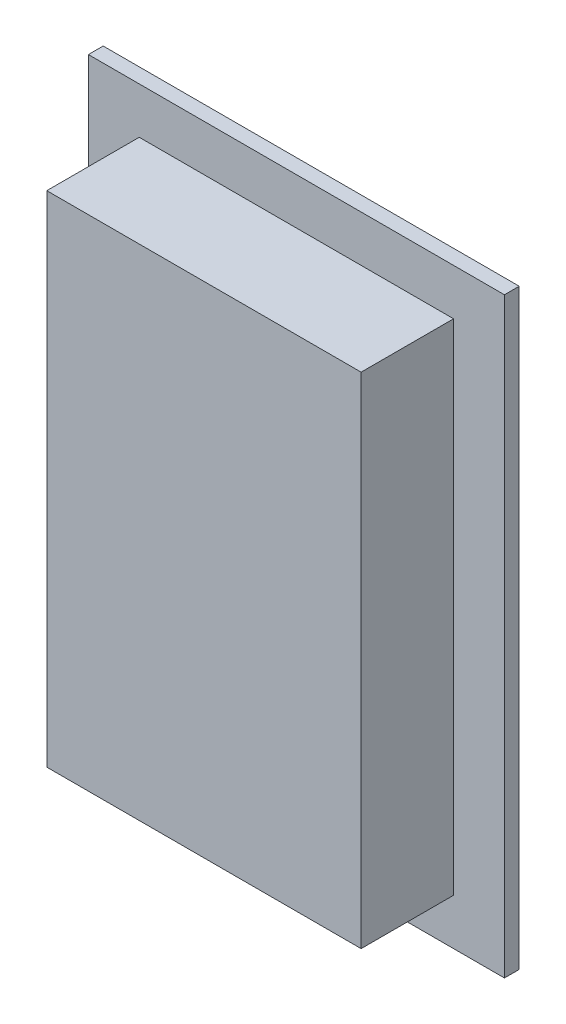
ISO-10303-21;
HEADER;
FILE_DESCRIPTION(('STEP AP214'),'2;1');
FILE_NAME('part.step','',(''),(''),'','','');
FILE_SCHEMA(('AUTOMOTIVE_DESIGN { 1 0 10303 214 1 1 1 1 }'));
ENDSEC;
DATA;
#1=APPLICATION_CONTEXT('core data for automotive mechanical design processes');
#2=APPLICATION_PROTOCOL_DEFINITION('international standard','automotive_design',2000,#1);
#3=PRODUCT_CONTEXT('',#1,'mechanical');
#4=PRODUCT('Part','Part','',(#3));
#5=PRODUCT_RELATED_PRODUCT_CATEGORY('part','',(#4));
#6=PRODUCT_DEFINITION_FORMATION('','',#4);
#7=PRODUCT_DEFINITION_CONTEXT('part definition',#1,'design');
#8=PRODUCT_DEFINITION('design','',#6,#7);
#9=PRODUCT_DEFINITION_SHAPE('','',#8);
#10=(LENGTH_UNIT() NAMED_UNIT(*) SI_UNIT(.MILLI.,.METRE.));
#11=(NAMED_UNIT(*) PLANE_ANGLE_UNIT() SI_UNIT($,.RADIAN.));
#12=(NAMED_UNIT(*) SI_UNIT($,.STERADIAN.) SOLID_ANGLE_UNIT());
#13=UNCERTAINTY_MEASURE_WITH_UNIT(LENGTH_MEASURE(1.E-05),#10,'distance_accuracy_value','');
#14=(GEOMETRIC_REPRESENTATION_CONTEXT(3) GLOBAL_UNCERTAINTY_ASSIGNED_CONTEXT((#13)) GLOBAL_UNIT_ASSIGNED_CONTEXT((#10,
#11,#12)) REPRESENTATION_CONTEXT('',''));
#15=CARTESIAN_POINT('',(0.,0.,0.));
#16=DIRECTION('',(0.,0.,1.));
#17=DIRECTION('',(1.,0.,0.));
#18=AXIS2_PLACEMENT_3D('',#15,#16,#17);
#19=CARTESIAN_POINT('',(0.,0.,19.2));
#20=DIRECTION('',(0.,0.,-1.));
#21=DIRECTION('',(-1.,0.,0.));
#22=AXIS2_PLACEMENT_3D('',#19,#20,#21);
#23=PLANE('',#22);
#24=DIRECTION('',(0.,-1.,0.));
#25=VECTOR('',#24,1.);
#26=CARTESIAN_POINT('',(-97.5,-32.,19.2));
#27=LINE('',#26,#25);
#28=CARTESIAN_POINT('',(-97.5,32.,19.2));
#29=VERTEX_POINT('',#28);
#30=CARTESIAN_POINT('',(-97.5,-32.,19.2));
#31=VERTEX_POINT('',#30);
#32=EDGE_CURVE('E139',#29,#31,#27,.T.);
#33=ORIENTED_EDGE('',*,*,#32,.T.);
#34=DIRECTION('',(1.,0.,0.));
#35=VECTOR('',#34,1.);
#36=CARTESIAN_POINT('',(-97.5,-32.,19.2));
#37=LINE('',#36,#35);
#38=CARTESIAN_POINT('',(-52.5,-32.,19.2));
#39=VERTEX_POINT('',#38);
#40=EDGE_CURVE('E143',#31,#39,#37,.T.);
#41=ORIENTED_EDGE('',*,*,#40,.T.);
#42=DIRECTION('',(0.,1.,0.));
#43=VECTOR('',#42,1.);
#44=CARTESIAN_POINT('',(-52.5,-32.,19.2));
#45=LINE('',#44,#43);
#46=CARTESIAN_POINT('',(-52.5,32.,19.2));
#47=VERTEX_POINT('',#46);
#48=EDGE_CURVE('E147',#39,#47,#45,.T.);
#49=ORIENTED_EDGE('',*,*,#48,.T.);
#50=DIRECTION('',(-1.,0.,0.));
#51=VECTOR('',#50,1.);
#52=CARTESIAN_POINT('',(-97.5,32.,19.2));
#53=LINE('',#52,#51);
#54=EDGE_CURVE('E150',#47,#29,#53,.T.);
#55=ORIENTED_EDGE('',*,*,#54,.T.);
#56=EDGE_LOOP('',(#33,#41,#49,#55));
#57=FACE_BOUND('',#56,.T.);
#58=DIRECTION('',(0.,-1.,0.));
#59=VECTOR('',#58,1.);
#60=CARTESIAN_POINT('',(-92.,-27.,19.2));
#61=LINE('',#60,#59);
#62=CARTESIAN_POINT('',(-92.,27.,19.2));
#63=VERTEX_POINT('',#62);
#64=CARTESIAN_POINT('',(-92.,-27.,19.2));
#65=VERTEX_POINT('',#64);
#66=EDGE_CURVE('E55',#63,#65,#61,.T.);
#67=ORIENTED_EDGE('',*,*,#66,.F.);
#68=DIRECTION('',(-1.,0.,0.));
#69=VECTOR('',#68,1.);
#70=CARTESIAN_POINT('',(-92.,27.,19.2));
#71=LINE('',#70,#69);
#72=CARTESIAN_POINT('',(-58.,27.,19.2));
#73=VERTEX_POINT('',#72);
#74=EDGE_CURVE('E59',#73,#63,#71,.T.);
#75=ORIENTED_EDGE('',*,*,#74,.F.);
#76=DIRECTION('',(0.,1.,0.));
#77=VECTOR('',#76,1.);
#78=CARTESIAN_POINT('',(-58.,-27.,19.2));
#79=LINE('',#78,#77);
#80=CARTESIAN_POINT('',(-58.,-27.,19.2));
#81=VERTEX_POINT('',#80);
#82=EDGE_CURVE('E283',#81,#73,#79,.T.);
#83=ORIENTED_EDGE('',*,*,#82,.F.);
#84=DIRECTION('',(1.,0.,0.));
#85=VECTOR('',#84,1.);
#86=CARTESIAN_POINT('',(-92.,-27.,19.2));
#87=LINE('',#86,#85);
#88=EDGE_CURVE('E293',#65,#81,#87,.T.);
#89=ORIENTED_EDGE('',*,*,#88,.F.);
#90=EDGE_LOOP('',(#67,#75,#83,#89));
#91=FACE_BOUND('',#90,.T.);
#92=ADVANCED_FACE('F39',(#57,#91),#23,.F.);
#93=CARTESIAN_POINT('',(-97.5,-32.,19.2));
#94=DIRECTION('',(1.,0.,0.));
#95=DIRECTION('',(0.,0.,-1.));
#96=AXIS2_PLACEMENT_3D('',#93,#94,#95);
#97=PLANE('',#96);
#98=DIRECTION('',(0.,-1.,0.));
#99=VECTOR('',#98,1.);
#100=CARTESIAN_POINT('',(-97.5,-32.,17.6));
#101=LINE('',#100,#99);
#102=CARTESIAN_POINT('',(-97.5,32.,17.6));
#103=VERTEX_POINT('',#102);
#104=CARTESIAN_POINT('',(-97.5,-32.,17.6));
#105=VERTEX_POINT('',#104);
#106=EDGE_CURVE('E128',#103,#105,#101,.T.);
#107=ORIENTED_EDGE('',*,*,#106,.T.);
#108=DIRECTION('',(0.,0.,-1.));
#109=VECTOR('',#108,1.);
#110=CARTESIAN_POINT('',(-97.5,-32.,19.2));
#111=LINE('',#110,#109);
#112=EDGE_CURVE('E11',#31,#105,#111,.T.);
#113=ORIENTED_EDGE('',*,*,#112,.F.);
#114=ORIENTED_EDGE('',*,*,#32,.F.);
#115=DIRECTION('',(0.,0.,-1.));
#116=VECTOR('',#115,1.);
#117=CARTESIAN_POINT('',(-97.5,32.,19.2));
#118=LINE('',#117,#116);
#119=EDGE_CURVE('E152',#29,#103,#118,.T.);
#120=ORIENTED_EDGE('',*,*,#119,.T.);
#121=EDGE_LOOP('',(#107,#113,#114,#120));
#122=FACE_BOUND('',#121,.T.);
#123=ADVANCED_FACE('F41',(#122),#97,.F.);
#124=CARTESIAN_POINT('',(-97.5,-32.,19.2));
#125=DIRECTION('',(0.,1.,0.));
#126=DIRECTION('',(0.,0.,1.));
#127=AXIS2_PLACEMENT_3D('',#124,#125,#126);
#128=PLANE('',#127);
#129=DIRECTION('',(1.,0.,0.));
#130=VECTOR('',#129,1.);
#131=CARTESIAN_POINT('',(-97.5,-32.,17.6));
#132=LINE('',#131,#130);
#133=CARTESIAN_POINT('',(-52.5,-32.,17.6));
#134=VERTEX_POINT('',#133);
#135=EDGE_CURVE('E133',#105,#134,#132,.T.);
#136=ORIENTED_EDGE('',*,*,#135,.T.);
#137=DIRECTION('',(0.,0.,-1.));
#138=VECTOR('',#137,1.);
#139=CARTESIAN_POINT('',(-52.5,-32.,19.2));
#140=LINE('',#139,#138);
#141=EDGE_CURVE('E48',#39,#134,#140,.T.);
#142=ORIENTED_EDGE('',*,*,#141,.F.);
#143=ORIENTED_EDGE('',*,*,#40,.F.);
#144=ORIENTED_EDGE('',*,*,#112,.T.);
#145=EDGE_LOOP('',(#136,#142,#143,#144));
#146=FACE_BOUND('',#145,.T.);
#147=ADVANCED_FACE('F188',(#146),#128,.F.);
#148=CARTESIAN_POINT('',(-52.5,-32.,19.2));
#149=DIRECTION('',(-1.,0.,0.));
#150=DIRECTION('',(0.,0.,1.));
#151=AXIS2_PLACEMENT_3D('',#148,#149,#150);
#152=PLANE('',#151);
#153=DIRECTION('',(0.,1.,0.));
#154=VECTOR('',#153,1.);
#155=CARTESIAN_POINT('',(-52.5,-32.,17.6));
#156=LINE('',#155,#154);
#157=CARTESIAN_POINT('',(-52.5,32.,17.6));
#158=VERTEX_POINT('',#157);
#159=EDGE_CURVE('E156',#134,#158,#156,.T.);
#160=ORIENTED_EDGE('',*,*,#159,.T.);
#161=DIRECTION('',(0.,0.,-1.));
#162=VECTOR('',#161,1.);
#163=CARTESIAN_POINT('',(-52.5,32.,19.2));
#164=LINE('',#163,#162);
#165=EDGE_CURVE('E164',#47,#158,#164,.T.);
#166=ORIENTED_EDGE('',*,*,#165,.F.);
#167=ORIENTED_EDGE('',*,*,#48,.F.);
#168=ORIENTED_EDGE('',*,*,#141,.T.);
#169=EDGE_LOOP('',(#160,#166,#167,#168));
#170=FACE_BOUND('',#169,.T.);
#171=ADVANCED_FACE('F173',(#170),#152,.F.);
#172=CARTESIAN_POINT('',(-97.5,32.,19.2));
#173=DIRECTION('',(0.,-1.,0.));
#174=DIRECTION('',(0.,0.,-1.));
#175=AXIS2_PLACEMENT_3D('',#172,#173,#174);
#176=PLANE('',#175);
#177=DIRECTION('',(-1.,0.,0.));
#178=VECTOR('',#177,1.);
#179=CARTESIAN_POINT('',(-97.5,32.,17.6));
#180=LINE('',#179,#178);
#181=EDGE_CURVE('E144',#158,#103,#180,.T.);
#182=ORIENTED_EDGE('',*,*,#181,.T.);
#183=ORIENTED_EDGE('',*,*,#119,.F.);
#184=ORIENTED_EDGE('',*,*,#54,.F.);
#185=ORIENTED_EDGE('',*,*,#165,.T.);
#186=EDGE_LOOP('',(#182,#183,#184,#185));
#187=FACE_BOUND('',#186,.T.);
#188=ADVANCED_FACE('F182',(#187),#176,.F.);
#189=CARTESIAN_POINT('',(0.,0.,17.6));
#190=DIRECTION('',(0.,0.,-1.));
#191=DIRECTION('',(-1.,0.,0.));
#192=AXIS2_PLACEMENT_3D('',#189,#190,#191);
#193=PLANE('',#192);
#194=ORIENTED_EDGE('',*,*,#106,.F.);
#195=ORIENTED_EDGE('',*,*,#181,.F.);
#196=ORIENTED_EDGE('',*,*,#159,.F.);
#197=ORIENTED_EDGE('',*,*,#135,.F.);
#198=EDGE_LOOP('',(#194,#195,#196,#197));
#199=FACE_BOUND('',#198,.T.);
#200=ADVANCED_FACE('F179',(#199),#193,.T.);
#201=CARTESIAN_POINT('',(-92.,-27.,29.2));
#202=DIRECTION('',(1.,0.,0.));
#203=DIRECTION('',(0.,0.,-1.));
#204=AXIS2_PLACEMENT_3D('',#201,#202,#203);
#205=PLANE('',#204);
#206=ORIENTED_EDGE('',*,*,#66,.T.);
#207=DIRECTION('',(0.,0.,-1.));
#208=VECTOR('',#207,1.);
#209=CARTESIAN_POINT('',(-92.,-27.,29.2));
#210=LINE('',#209,#208);
#211=CARTESIAN_POINT('',(-92.,-27.,29.2));
#212=VERTEX_POINT('',#211);
#213=EDGE_CURVE('E108',#212,#65,#210,.T.);
#214=ORIENTED_EDGE('',*,*,#213,.F.);
#215=DIRECTION('',(0.,-1.,0.));
#216=VECTOR('',#215,1.);
#217=CARTESIAN_POINT('',(-92.,-27.,29.2));
#218=LINE('',#217,#216);
#219=CARTESIAN_POINT('',(-92.,27.,29.2));
#220=VERTEX_POINT('',#219);
#221=EDGE_CURVE('E115',#220,#212,#218,.T.);
#222=ORIENTED_EDGE('',*,*,#221,.F.);
#223=DIRECTION('',(0.,0.,-1.));
#224=VECTOR('',#223,1.);
#225=CARTESIAN_POINT('',(-92.,27.,29.2));
#226=LINE('',#225,#224);
#227=EDGE_CURVE('E280',#220,#63,#226,.T.);
#228=ORIENTED_EDGE('',*,*,#227,.T.);
#229=EDGE_LOOP('',(#206,#214,#222,#228));
#230=FACE_BOUND('',#229,.T.);
#231=ADVANCED_FACE('F126',(#230),#205,.F.);
#232=CARTESIAN_POINT('',(-92.,-27.,29.2));
#233=DIRECTION('',(0.,1.,0.));
#234=DIRECTION('',(0.,0.,1.));
#235=AXIS2_PLACEMENT_3D('',#232,#233,#234);
#236=PLANE('',#235);
#237=ORIENTED_EDGE('',*,*,#88,.T.);
#238=DIRECTION('',(0.,0.,-1.));
#239=VECTOR('',#238,1.);
#240=CARTESIAN_POINT('',(-58.,-27.,29.2));
#241=LINE('',#240,#239);
#242=CARTESIAN_POINT('',(-58.,-27.,29.2));
#243=VERTEX_POINT('',#242);
#244=EDGE_CURVE('E110',#243,#81,#241,.T.);
#245=ORIENTED_EDGE('',*,*,#244,.F.);
#246=DIRECTION('',(1.,0.,0.));
#247=VECTOR('',#246,1.);
#248=CARTESIAN_POINT('',(-92.,-27.,29.2));
#249=LINE('',#248,#247);
#250=EDGE_CURVE('E103',#212,#243,#249,.T.);
#251=ORIENTED_EDGE('',*,*,#250,.F.);
#252=ORIENTED_EDGE('',*,*,#213,.T.);
#253=EDGE_LOOP('',(#237,#245,#251,#252));
#254=FACE_BOUND('',#253,.T.);
#255=ADVANCED_FACE('F106',(#254),#236,.F.);
#256=CARTESIAN_POINT('',(-58.,-27.,29.2));
#257=DIRECTION('',(-1.,0.,0.));
#258=DIRECTION('',(0.,0.,1.));
#259=AXIS2_PLACEMENT_3D('',#256,#257,#258);
#260=PLANE('',#259);
#261=ORIENTED_EDGE('',*,*,#82,.T.);
#262=DIRECTION('',(0.,0.,-1.));
#263=VECTOR('',#262,1.);
#264=CARTESIAN_POINT('',(-58.,27.,29.2));
#265=LINE('',#264,#263);
#266=CARTESIAN_POINT('',(-58.,27.,29.2));
#267=VERTEX_POINT('',#266);
#268=EDGE_CURVE('E135',#267,#73,#265,.T.);
#269=ORIENTED_EDGE('',*,*,#268,.F.);
#270=DIRECTION('',(0.,1.,0.));
#271=VECTOR('',#270,1.);
#272=CARTESIAN_POINT('',(-58.,-27.,29.2));
#273=LINE('',#272,#271);
#274=EDGE_CURVE('E114',#243,#267,#273,.T.);
#275=ORIENTED_EDGE('',*,*,#274,.F.);
#276=ORIENTED_EDGE('',*,*,#244,.T.);
#277=EDGE_LOOP('',(#261,#269,#275,#276));
#278=FACE_BOUND('',#277,.T.);
#279=ADVANCED_FACE('F224',(#278),#260,.F.);
#280=CARTESIAN_POINT('',(-92.,27.,29.2));
#281=DIRECTION('',(0.,-1.,0.));
#282=DIRECTION('',(0.,0.,-1.));
#283=AXIS2_PLACEMENT_3D('',#280,#281,#282);
#284=PLANE('',#283);
#285=ORIENTED_EDGE('',*,*,#74,.T.);
#286=ORIENTED_EDGE('',*,*,#227,.F.);
#287=DIRECTION('',(-1.,0.,0.));
#288=VECTOR('',#287,1.);
#289=CARTESIAN_POINT('',(-92.,27.,29.2));
#290=LINE('',#289,#288);
#291=EDGE_CURVE('E120',#267,#220,#290,.T.);
#292=ORIENTED_EDGE('',*,*,#291,.F.);
#293=ORIENTED_EDGE('',*,*,#268,.T.);
#294=EDGE_LOOP('',(#285,#286,#292,#293));
#295=FACE_BOUND('',#294,.T.);
#296=ADVANCED_FACE('F230',(#295),#284,.F.);
#297=CARTESIAN_POINT('',(0.,0.,29.2));
#298=DIRECTION('',(0.,0.,-1.));
#299=DIRECTION('',(-1.,0.,0.));
#300=AXIS2_PLACEMENT_3D('',#297,#298,#299);
#301=PLANE('',#300);
#302=ORIENTED_EDGE('',*,*,#221,.T.);
#303=ORIENTED_EDGE('',*,*,#250,.T.);
#304=ORIENTED_EDGE('',*,*,#274,.T.);
#305=ORIENTED_EDGE('',*,*,#291,.T.);
#306=EDGE_LOOP('',(#302,#303,#304,#305));
#307=FACE_BOUND('',#306,.T.);
#308=ADVANCED_FACE('F118',(#307),#301,.F.);
#309=CLOSED_SHELL('',(#92,#123,#147,#171,#188,#200,#231,#255,#279,#296,#308));
#310=MANIFOLD_SOLID_BREP('B2',#309);
#311=ADVANCED_BREP_SHAPE_REPRESENTATION('',(#18,#310),#14);
#312=SHAPE_DEFINITION_REPRESENTATION(#9,#311);
ENDSEC;
END-ISO-10303-21;
